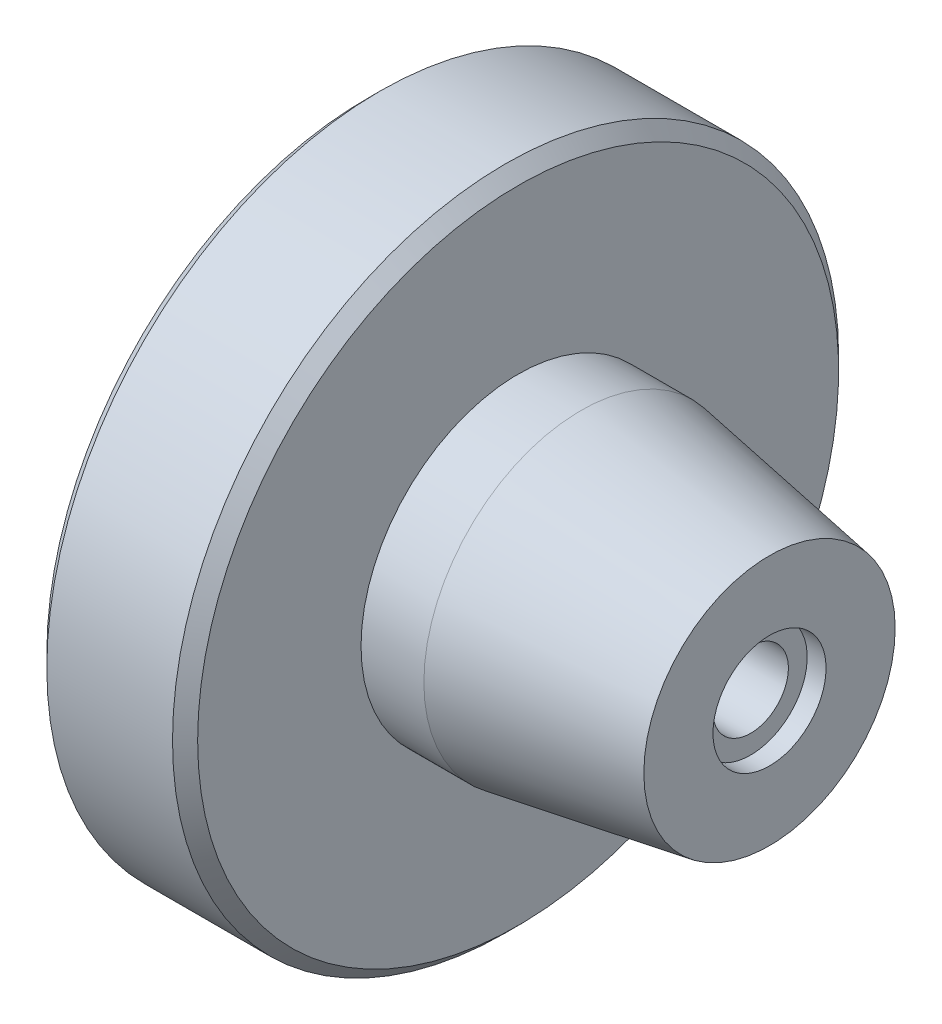
ISO-10303-21;
HEADER;
FILE_DESCRIPTION(('STEP AP214'),'2;1');
FILE_NAME('part.step','',(''),(''),'','','');
FILE_SCHEMA(('AUTOMOTIVE_DESIGN { 1 0 10303 214 1 1 1 1 }'));
ENDSEC;
DATA;
#1=APPLICATION_CONTEXT('core data for automotive mechanical design processes');
#2=APPLICATION_PROTOCOL_DEFINITION('international standard','automotive_design',2000,#1);
#3=PRODUCT_CONTEXT('',#1,'mechanical');
#4=PRODUCT('Part','Part','',(#3));
#5=PRODUCT_RELATED_PRODUCT_CATEGORY('part','',(#4));
#6=PRODUCT_DEFINITION_FORMATION('','',#4);
#7=PRODUCT_DEFINITION_CONTEXT('part definition',#1,'design');
#8=PRODUCT_DEFINITION('design','',#6,#7);
#9=PRODUCT_DEFINITION_SHAPE('','',#8);
#10=(LENGTH_UNIT() NAMED_UNIT(*) SI_UNIT(.MILLI.,.METRE.));
#11=(NAMED_UNIT(*) PLANE_ANGLE_UNIT() SI_UNIT($,.RADIAN.));
#12=(NAMED_UNIT(*) SI_UNIT($,.STERADIAN.) SOLID_ANGLE_UNIT());
#13=UNCERTAINTY_MEASURE_WITH_UNIT(LENGTH_MEASURE(1.E-05),#10,'distance_accuracy_value','');
#14=(GEOMETRIC_REPRESENTATION_CONTEXT(3) GLOBAL_UNCERTAINTY_ASSIGNED_CONTEXT((#13)) GLOBAL_UNIT_ASSIGNED_CONTEXT((#10,
#11,#12)) REPRESENTATION_CONTEXT('',''));
#15=CARTESIAN_POINT('',(0.,0.,0.));
#16=DIRECTION('',(0.,0.,1.));
#17=DIRECTION('',(1.,0.,0.));
#18=AXIS2_PLACEMENT_3D('',#15,#16,#17);
#19=CARTESIAN_POINT('',(0.,4.5,0.));
#20=DIRECTION('',(1.,0.,0.));
#21=DIRECTION('',(0.,0.,-1.));
#22=AXIS2_PLACEMENT_3D('',#19,#20,#21);
#23=PLANE('',#22);
#24=CARTESIAN_POINT('',(0.,0.,0.));
#25=DIRECTION('',(-1.,0.,0.));
#26=DIRECTION('',(0.,0.,1.));
#27=AXIS2_PLACEMENT_3D('',#24,#25,#26);
#28=CIRCLE('',#27,4.5);
#29=CARTESIAN_POINT('',(0.,0.,4.5));
#30=VERTEX_POINT('',#29);
#31=EDGE_CURVE('E83',#30,#30,#28,.T.);
#32=ORIENTED_EDGE('',*,*,#31,.F.);
#33=EDGE_LOOP('',(#32));
#34=FACE_BOUND('',#33,.T.);
#35=CARTESIAN_POINT('',(0.,0.,0.));
#36=DIRECTION('',(-1.,0.,0.));
#37=DIRECTION('',(0.,0.,1.));
#38=AXIS2_PLACEMENT_3D('',#35,#36,#37);
#39=CIRCLE('',#38,11.5);
#40=CARTESIAN_POINT('',(0.,0.,11.5));
#41=VERTEX_POINT('',#40);
#42=EDGE_CURVE('E10',#41,#41,#39,.T.);
#43=ORIENTED_EDGE('',*,*,#42,.T.);
#44=EDGE_LOOP('',(#43));
#45=FACE_BOUND('',#44,.T.);
#46=ADVANCED_FACE('F31',(#34,#45),#23,.F.);
#47=CARTESIAN_POINT('',(1.,0.,0.));
#48=DIRECTION('',(1.,0.,0.));
#49=DIRECTION('',(0.,0.,-1.));
#50=AXIS2_PLACEMENT_3D('',#47,#48,#49);
#51=CONICAL_SURFACE('',#50,12.5,0.785398163397449);
#52=ORIENTED_EDGE('',*,*,#42,.F.);
#53=EDGE_LOOP('',(#52));
#54=FACE_BOUND('',#53,.T.);
#55=CARTESIAN_POINT('',(1.,0.,0.));
#56=DIRECTION('',(-1.,0.,0.));
#57=DIRECTION('',(0.,0.,1.));
#58=AXIS2_PLACEMENT_3D('',#55,#56,#57);
#59=CIRCLE('',#58,12.5);
#60=CARTESIAN_POINT('',(1.,0.,12.5));
#61=VERTEX_POINT('',#60);
#62=EDGE_CURVE('E37',#61,#61,#59,.T.);
#63=ORIENTED_EDGE('',*,*,#62,.T.);
#64=EDGE_LOOP('',(#63));
#65=FACE_BOUND('',#64,.T.);
#66=ADVANCED_FACE('F90',(#54,#65),#51,.T.);
#67=CARTESIAN_POINT('',(0.,0.,0.));
#68=DIRECTION('',(-1.,0.,0.));
#69=DIRECTION('',(0.,0.,1.));
#70=AXIS2_PLACEMENT_3D('',#67,#68,#69);
#71=CYLINDRICAL_SURFACE('',#70,12.5);
#72=ORIENTED_EDGE('',*,*,#62,.F.);
#73=EDGE_LOOP('',(#72));
#74=FACE_BOUND('',#73,.T.);
#75=CARTESIAN_POINT('',(8.,0.,0.));
#76=DIRECTION('',(-1.,0.,0.));
#77=DIRECTION('',(0.,0.,1.));
#78=AXIS2_PLACEMENT_3D('',#75,#76,#77);
#79=CIRCLE('',#78,12.5);
#80=CARTESIAN_POINT('',(8.,0.,12.5));
#81=VERTEX_POINT('',#80);
#82=EDGE_CURVE('E41',#81,#81,#79,.T.);
#83=ORIENTED_EDGE('',*,*,#82,.T.);
#84=EDGE_LOOP('',(#83));
#85=FACE_BOUND('',#84,.T.);
#86=ADVANCED_FACE('F94',(#74,#85),#71,.T.);
#87=CARTESIAN_POINT('',(8.,12.5,0.));
#88=DIRECTION('',(1.,0.,0.));
#89=DIRECTION('',(0.,0.,-1.));
#90=AXIS2_PLACEMENT_3D('',#87,#88,#89);
#91=PLANE('',#90);
#92=ORIENTED_EDGE('',*,*,#82,.F.);
#93=EDGE_LOOP('',(#92));
#94=FACE_BOUND('',#93,.T.);
#95=CARTESIAN_POINT('',(8.,0.,0.));
#96=DIRECTION('',(-1.,0.,0.));
#97=DIRECTION('',(0.,0.,1.));
#98=AXIS2_PLACEMENT_3D('',#95,#96,#97);
#99=CIRCLE('',#98,25.5);
#100=CARTESIAN_POINT('',(8.,0.,25.5));
#101=VERTEX_POINT('',#100);
#102=EDGE_CURVE('E45',#101,#101,#99,.T.);
#103=ORIENTED_EDGE('',*,*,#102,.T.);
#104=EDGE_LOOP('',(#103));
#105=FACE_BOUND('',#104,.T.);
#106=ADVANCED_FACE('F99',(#94,#105),#91,.F.);
#107=CARTESIAN_POINT('',(9.,0.,0.));
#108=DIRECTION('',(1.,0.,0.));
#109=DIRECTION('',(0.,0.,-1.));
#110=AXIS2_PLACEMENT_3D('',#107,#108,#109);
#111=CONICAL_SURFACE('',#110,26.5,0.785398163397449);
#112=ORIENTED_EDGE('',*,*,#102,.F.);
#113=EDGE_LOOP('',(#112));
#114=FACE_BOUND('',#113,.T.);
#115=CARTESIAN_POINT('',(9.,0.,0.));
#116=DIRECTION('',(-1.,0.,0.));
#117=DIRECTION('',(0.,0.,1.));
#118=AXIS2_PLACEMENT_3D('',#115,#116,#117);
#119=CIRCLE('',#118,26.5);
#120=CARTESIAN_POINT('',(9.,0.,26.5));
#121=VERTEX_POINT('',#120);
#122=EDGE_CURVE('E50',#121,#121,#119,.T.);
#123=ORIENTED_EDGE('',*,*,#122,.T.);
#124=EDGE_LOOP('',(#123));
#125=FACE_BOUND('',#124,.T.);
#126=ADVANCED_FACE('F105',(#114,#125),#111,.T.);
#127=CARTESIAN_POINT('',(0.,0.,0.));
#128=DIRECTION('',(-1.,0.,0.));
#129=DIRECTION('',(0.,0.,1.));
#130=AXIS2_PLACEMENT_3D('',#127,#128,#129);
#131=CYLINDRICAL_SURFACE('',#130,26.5);
#132=ORIENTED_EDGE('',*,*,#122,.F.);
#133=EDGE_LOOP('',(#132));
#134=FACE_BOUND('',#133,.T.);
#135=CARTESIAN_POINT('',(19.,0.,0.));
#136=DIRECTION('',(-1.,0.,0.));
#137=DIRECTION('',(0.,0.,1.));
#138=AXIS2_PLACEMENT_3D('',#135,#136,#137);
#139=CIRCLE('',#138,26.5);
#140=CARTESIAN_POINT('',(19.,0.,26.5));
#141=VERTEX_POINT('',#140);
#142=EDGE_CURVE('E53',#141,#141,#139,.T.);
#143=ORIENTED_EDGE('',*,*,#142,.T.);
#144=EDGE_LOOP('',(#143));
#145=FACE_BOUND('',#144,.T.);
#146=ADVANCED_FACE('F109',(#134,#145),#131,.T.);
#147=CARTESIAN_POINT('',(20.,0.,0.));
#148=DIRECTION('',(-1.,0.,0.));
#149=DIRECTION('',(0.,0.,1.));
#150=AXIS2_PLACEMENT_3D('',#147,#148,#149);
#151=CONICAL_SURFACE('',#150,25.5,0.785398163397448);
#152=ORIENTED_EDGE('',*,*,#142,.F.);
#153=EDGE_LOOP('',(#152));
#154=FACE_BOUND('',#153,.T.);
#155=CARTESIAN_POINT('',(20.,0.,0.));
#156=DIRECTION('',(-1.,0.,0.));
#157=DIRECTION('',(0.,0.,1.));
#158=AXIS2_PLACEMENT_3D('',#155,#156,#157);
#159=CIRCLE('',#158,25.5);
#160=CARTESIAN_POINT('',(20.,0.,25.5));
#161=VERTEX_POINT('',#160);
#162=EDGE_CURVE('E56',#161,#161,#159,.T.);
#163=ORIENTED_EDGE('',*,*,#162,.T.);
#164=EDGE_LOOP('',(#163));
#165=FACE_BOUND('',#164,.T.);
#166=ADVANCED_FACE('F113',(#154,#165),#151,.T.);
#167=CARTESIAN_POINT('',(20.,25.5,0.));
#168=DIRECTION('',(-1.,0.,0.));
#169=DIRECTION('',(0.,0.,1.));
#170=AXIS2_PLACEMENT_3D('',#167,#168,#169);
#171=PLANE('',#170);
#172=ORIENTED_EDGE('',*,*,#162,.F.);
#173=EDGE_LOOP('',(#172));
#174=FACE_BOUND('',#173,.T.);
#175=CARTESIAN_POINT('',(20.,0.,0.));
#176=DIRECTION('',(-1.,0.,0.));
#177=DIRECTION('',(0.,0.,1.));
#178=AXIS2_PLACEMENT_3D('',#175,#176,#177);
#179=CIRCLE('',#178,12.5);
#180=CARTESIAN_POINT('',(20.,0.,12.5));
#181=VERTEX_POINT('',#180);
#182=EDGE_CURVE('E59',#181,#181,#179,.T.);
#183=ORIENTED_EDGE('',*,*,#182,.T.);
#184=EDGE_LOOP('',(#183));
#185=FACE_BOUND('',#184,.T.);
#186=ADVANCED_FACE('F117',(#174,#185),#171,.F.);
#187=CARTESIAN_POINT('',(0.,0.,0.));
#188=DIRECTION('',(-1.,0.,0.));
#189=DIRECTION('',(0.,0.,1.));
#190=AXIS2_PLACEMENT_3D('',#187,#188,#189);
#191=CYLINDRICAL_SURFACE('',#190,12.5);
#192=ORIENTED_EDGE('',*,*,#182,.F.);
#193=EDGE_LOOP('',(#192));
#194=FACE_BOUND('',#193,.T.);
#195=CARTESIAN_POINT('',(25.,0.,0.));
#196=DIRECTION('',(-1.,0.,0.));
#197=DIRECTION('',(0.,0.,1.));
#198=AXIS2_PLACEMENT_3D('',#195,#196,#197);
#199=CIRCLE('',#198,12.5);
#200=CARTESIAN_POINT('',(25.,0.,12.5));
#201=VERTEX_POINT('',#200);
#202=EDGE_CURVE('E62',#201,#201,#199,.T.);
#203=ORIENTED_EDGE('',*,*,#202,.T.);
#204=EDGE_LOOP('',(#203));
#205=FACE_BOUND('',#204,.T.);
#206=ADVANCED_FACE('F121',(#194,#205),#191,.T.);
#207=CARTESIAN_POINT('',(40.,0.,0.));
#208=DIRECTION('',(-1.,0.,0.));
#209=DIRECTION('',(0.,0.,1.));
#210=AXIS2_PLACEMENT_3D('',#207,#208,#209);
#211=CONICAL_SURFACE('',#210,10.,0.165148677414627);
#212=ORIENTED_EDGE('',*,*,#202,.F.);
#213=EDGE_LOOP('',(#212));
#214=FACE_BOUND('',#213,.T.);
#215=CARTESIAN_POINT('',(40.,0.,0.));
#216=DIRECTION('',(-1.,0.,0.));
#217=DIRECTION('',(0.,0.,1.));
#218=AXIS2_PLACEMENT_3D('',#215,#216,#217);
#219=CIRCLE('',#218,10.);
#220=CARTESIAN_POINT('',(40.,0.,10.));
#221=VERTEX_POINT('',#220);
#222=EDGE_CURVE('E65',#221,#221,#219,.T.);
#223=ORIENTED_EDGE('',*,*,#222,.T.);
#224=EDGE_LOOP('',(#223));
#225=FACE_BOUND('',#224,.T.);
#226=ADVANCED_FACE('F125',(#214,#225),#211,.T.);
#227=CARTESIAN_POINT('',(40.,10.,0.));
#228=DIRECTION('',(-1.,0.,0.));
#229=DIRECTION('',(0.,0.,1.));
#230=AXIS2_PLACEMENT_3D('',#227,#228,#229);
#231=PLANE('',#230);
#232=ORIENTED_EDGE('',*,*,#222,.F.);
#233=EDGE_LOOP('',(#232));
#234=FACE_BOUND('',#233,.T.);
#235=CARTESIAN_POINT('',(40.,0.,0.));
#236=DIRECTION('',(-1.,0.,0.));
#237=DIRECTION('',(0.,0.,1.));
#238=AXIS2_PLACEMENT_3D('',#235,#236,#237);
#239=CIRCLE('',#238,4.5);
#240=CARTESIAN_POINT('',(40.,0.,4.5));
#241=VERTEX_POINT('',#240);
#242=EDGE_CURVE('E68',#241,#241,#239,.T.);
#243=ORIENTED_EDGE('',*,*,#242,.T.);
#244=EDGE_LOOP('',(#243));
#245=FACE_BOUND('',#244,.T.);
#246=ADVANCED_FACE('F129',(#234,#245),#231,.F.);
#247=CARTESIAN_POINT('',(0.,0.,0.));
#248=DIRECTION('',(-1.,0.,0.));
#249=DIRECTION('',(0.,0.,1.));
#250=AXIS2_PLACEMENT_3D('',#247,#248,#249);
#251=CYLINDRICAL_SURFACE('',#250,4.5);
#252=ORIENTED_EDGE('',*,*,#242,.F.);
#253=EDGE_LOOP('',(#252));
#254=FACE_BOUND('',#253,.T.);
#255=CARTESIAN_POINT('',(38.5,0.,0.));
#256=DIRECTION('',(-1.,0.,0.));
#257=DIRECTION('',(0.,0.,1.));
#258=AXIS2_PLACEMENT_3D('',#255,#256,#257);
#259=CIRCLE('',#258,4.5);
#260=CARTESIAN_POINT('',(38.5,0.,4.5));
#261=VERTEX_POINT('',#260);
#262=EDGE_CURVE('E71',#261,#261,#259,.T.);
#263=ORIENTED_EDGE('',*,*,#262,.T.);
#264=EDGE_LOOP('',(#263));
#265=FACE_BOUND('',#264,.T.);
#266=ADVANCED_FACE('F133',(#254,#265),#251,.F.);
#267=CARTESIAN_POINT('',(38.5,4.5,0.));
#268=DIRECTION('',(-1.,0.,0.));
#269=DIRECTION('',(0.,0.,1.));
#270=AXIS2_PLACEMENT_3D('',#267,#268,#269);
#271=PLANE('',#270);
#272=ORIENTED_EDGE('',*,*,#262,.F.);
#273=EDGE_LOOP('',(#272));
#274=FACE_BOUND('',#273,.T.);
#275=CARTESIAN_POINT('',(38.5,0.,0.));
#276=DIRECTION('',(-1.,0.,0.));
#277=DIRECTION('',(0.,0.,1.));
#278=AXIS2_PLACEMENT_3D('',#275,#276,#277);
#279=CIRCLE('',#278,3.);
#280=CARTESIAN_POINT('',(38.5,0.,3.));
#281=VERTEX_POINT('',#280);
#282=EDGE_CURVE('E74',#281,#281,#279,.T.);
#283=ORIENTED_EDGE('',*,*,#282,.T.);
#284=EDGE_LOOP('',(#283));
#285=FACE_BOUND('',#284,.T.);
#286=ADVANCED_FACE('F137',(#274,#285),#271,.F.);
#287=CARTESIAN_POINT('',(0.,0.,0.));
#288=DIRECTION('',(-1.,0.,0.));
#289=DIRECTION('',(0.,0.,1.));
#290=AXIS2_PLACEMENT_3D('',#287,#288,#289);
#291=CYLINDRICAL_SURFACE('',#290,3.);
#292=ORIENTED_EDGE('',*,*,#282,.F.);
#293=EDGE_LOOP('',(#292));
#294=FACE_BOUND('',#293,.T.);
#295=CARTESIAN_POINT('',(1.5,0.,0.));
#296=DIRECTION('',(-1.,0.,0.));
#297=DIRECTION('',(0.,0.,1.));
#298=AXIS2_PLACEMENT_3D('',#295,#296,#297);
#299=CIRCLE('',#298,3.);
#300=CARTESIAN_POINT('',(1.5,0.,3.));
#301=VERTEX_POINT('',#300);
#302=EDGE_CURVE('E77',#301,#301,#299,.T.);
#303=ORIENTED_EDGE('',*,*,#302,.T.);
#304=EDGE_LOOP('',(#303));
#305=FACE_BOUND('',#304,.T.);
#306=ADVANCED_FACE('F141',(#294,#305),#291,.F.);
#307=CARTESIAN_POINT('',(1.5,3.,0.));
#308=DIRECTION('',(1.,0.,0.));
#309=DIRECTION('',(0.,0.,-1.));
#310=AXIS2_PLACEMENT_3D('',#307,#308,#309);
#311=PLANE('',#310);
#312=ORIENTED_EDGE('',*,*,#302,.F.);
#313=EDGE_LOOP('',(#312));
#314=FACE_BOUND('',#313,.T.);
#315=CARTESIAN_POINT('',(1.5,0.,0.));
#316=DIRECTION('',(-1.,0.,0.));
#317=DIRECTION('',(0.,0.,1.));
#318=AXIS2_PLACEMENT_3D('',#315,#316,#317);
#319=CIRCLE('',#318,4.5);
#320=CARTESIAN_POINT('',(1.5,0.,4.5));
#321=VERTEX_POINT('',#320);
#322=EDGE_CURVE('E80',#321,#321,#319,.T.);
#323=ORIENTED_EDGE('',*,*,#322,.T.);
#324=EDGE_LOOP('',(#323));
#325=FACE_BOUND('',#324,.T.);
#326=ADVANCED_FACE('F145',(#314,#325),#311,.F.);
#327=CARTESIAN_POINT('',(0.,0.,0.));
#328=DIRECTION('',(-1.,0.,0.));
#329=DIRECTION('',(0.,0.,1.));
#330=AXIS2_PLACEMENT_3D('',#327,#328,#329);
#331=CYLINDRICAL_SURFACE('',#330,4.5);
#332=ORIENTED_EDGE('',*,*,#322,.F.);
#333=EDGE_LOOP('',(#332));
#334=FACE_BOUND('',#333,.T.);
#335=ORIENTED_EDGE('',*,*,#31,.T.);
#336=EDGE_LOOP('',(#335));
#337=FACE_BOUND('',#336,.T.);
#338=ADVANCED_FACE('F87',(#334,#337),#331,.F.);
#339=CLOSED_SHELL('',(#46,#66,#86,#106,#126,#146,#166,#186,#206,#226,#246,#266,#286,#306,#326,#338));
#340=MANIFOLD_SOLID_BREP('B2',#339);
#341=ADVANCED_BREP_SHAPE_REPRESENTATION('',(#18,#340),#14);
#342=SHAPE_DEFINITION_REPRESENTATION(#9,#341);
ENDSEC;
END-ISO-10303-21;
